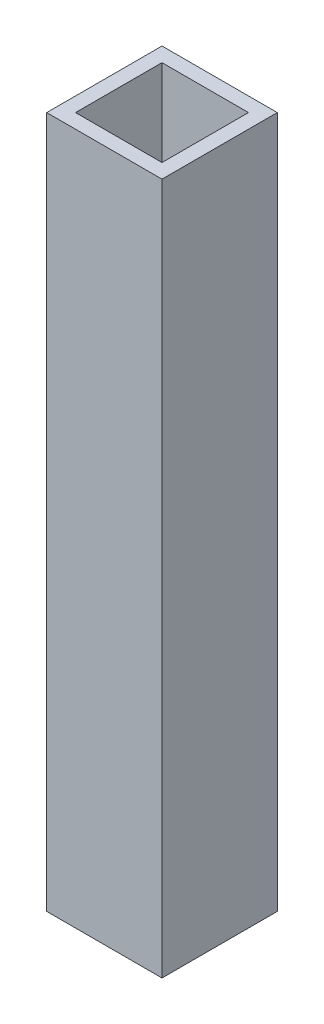
ISO-10303-21;
HEADER;
FILE_DESCRIPTION(('STEP AP214'),'2;1');
FILE_NAME('part.step','',(''),(''),'','','');
FILE_SCHEMA(('AUTOMOTIVE_DESIGN { 1 0 10303 214 1 1 1 1 }'));
ENDSEC;
DATA;
#1=APPLICATION_CONTEXT('core data for automotive mechanical design processes');
#2=APPLICATION_PROTOCOL_DEFINITION('international standard','automotive_design',2000,#1);
#3=PRODUCT_CONTEXT('',#1,'mechanical');
#4=PRODUCT('Part','Part','',(#3));
#5=PRODUCT_RELATED_PRODUCT_CATEGORY('part','',(#4));
#6=PRODUCT_DEFINITION_FORMATION('','',#4);
#7=PRODUCT_DEFINITION_CONTEXT('part definition',#1,'design');
#8=PRODUCT_DEFINITION('design','',#6,#7);
#9=PRODUCT_DEFINITION_SHAPE('','',#8);
#10=(LENGTH_UNIT() NAMED_UNIT(*) SI_UNIT(.MILLI.,.METRE.));
#11=(NAMED_UNIT(*) PLANE_ANGLE_UNIT() SI_UNIT($,.RADIAN.));
#12=(NAMED_UNIT(*) SI_UNIT($,.STERADIAN.) SOLID_ANGLE_UNIT());
#13=UNCERTAINTY_MEASURE_WITH_UNIT(LENGTH_MEASURE(1.E-05),#10,'distance_accuracy_value','');
#14=(GEOMETRIC_REPRESENTATION_CONTEXT(3) GLOBAL_UNCERTAINTY_ASSIGNED_CONTEXT((#13)) GLOBAL_UNIT_ASSIGNED_CONTEXT((#10,
#11,#12)) REPRESENTATION_CONTEXT('',''));
#15=CARTESIAN_POINT('',(0.,0.,0.));
#16=DIRECTION('',(0.,0.,1.));
#17=DIRECTION('',(1.,0.,0.));
#18=AXIS2_PLACEMENT_3D('',#15,#16,#17);
#19=CARTESIAN_POINT('',(0.,152.4,0.));
#20=DIRECTION('',(0.,-1.,0.));
#21=DIRECTION('',(0.,0.,-1.));
#22=AXIS2_PLACEMENT_3D('',#19,#20,#21);
#23=PLANE('',#22);
#24=DIRECTION('',(0.,0.,1.));
#25=VECTOR('',#24,1.);
#26=CARTESIAN_POINT('',(0.,152.4,0.));
#27=LINE('',#26,#25);
#28=CARTESIAN_POINT('',(0.,152.4,-25.4));
#29=VERTEX_POINT('',#28);
#30=CARTESIAN_POINT('',(0.,152.4,0.));
#31=VERTEX_POINT('',#30);
#32=EDGE_CURVE('E134',#29,#31,#27,.T.);
#33=ORIENTED_EDGE('',*,*,#32,.T.);
#34=DIRECTION('',(1.,0.,0.));
#35=VECTOR('',#34,1.);
#36=CARTESIAN_POINT('',(0.,152.4,0.));
#37=LINE('',#36,#35);
#38=CARTESIAN_POINT('',(25.4,152.4,0.));
#39=VERTEX_POINT('',#38);
#40=EDGE_CURVE('E137',#31,#39,#37,.T.);
#41=ORIENTED_EDGE('',*,*,#40,.T.);
#42=DIRECTION('',(0.,0.,-1.));
#43=VECTOR('',#42,1.);
#44=CARTESIAN_POINT('',(25.4,152.4,0.));
#45=LINE('',#44,#43);
#46=CARTESIAN_POINT('',(25.4,152.4,-25.4));
#47=VERTEX_POINT('',#46);
#48=EDGE_CURVE('E140',#39,#47,#45,.T.);
#49=ORIENTED_EDGE('',*,*,#48,.T.);
#50=DIRECTION('',(-1.,0.,0.));
#51=VECTOR('',#50,1.);
#52=CARTESIAN_POINT('',(0.,152.4,-25.4));
#53=LINE('',#52,#51);
#54=EDGE_CURVE('E142',#47,#29,#53,.T.);
#55=ORIENTED_EDGE('',*,*,#54,.T.);
#56=EDGE_LOOP('',(#33,#41,#49,#55));
#57=FACE_BOUND('',#56,.T.);
#58=DIRECTION('',(0.,0.,1.));
#59=VECTOR('',#58,1.);
#60=CARTESIAN_POINT('',(3.175,152.4,-3.175));
#61=LINE('',#60,#59);
#62=CARTESIAN_POINT('',(3.175,152.4,-22.225));
#63=VERTEX_POINT('',#62);
#64=CARTESIAN_POINT('',(3.175,152.4,-3.175));
#65=VERTEX_POINT('',#64);
#66=EDGE_CURVE('E98',#63,#65,#61,.T.);
#67=ORIENTED_EDGE('',*,*,#66,.F.);
#68=DIRECTION('',(-1.,0.,0.));
#69=VECTOR('',#68,1.);
#70=CARTESIAN_POINT('',(3.175,152.4,-22.225));
#71=LINE('',#70,#69);
#72=CARTESIAN_POINT('',(22.225,152.4,-22.225));
#73=VERTEX_POINT('',#72);
#74=EDGE_CURVE('E120',#73,#63,#71,.T.);
#75=ORIENTED_EDGE('',*,*,#74,.F.);
#76=DIRECTION('',(0.,0.,-1.));
#77=VECTOR('',#76,1.);
#78=CARTESIAN_POINT('',(22.225,152.4,-3.175));
#79=LINE('',#78,#77);
#80=CARTESIAN_POINT('',(22.225,152.4,-3.175));
#81=VERTEX_POINT('',#80);
#82=EDGE_CURVE('E118',#81,#73,#79,.T.);
#83=ORIENTED_EDGE('',*,*,#82,.F.);
#84=DIRECTION('',(1.,0.,0.));
#85=VECTOR('',#84,1.);
#86=CARTESIAN_POINT('',(3.175,152.4,-3.175));
#87=LINE('',#86,#85);
#88=EDGE_CURVE('E106',#65,#81,#87,.T.);
#89=ORIENTED_EDGE('',*,*,#88,.F.);
#90=EDGE_LOOP('',(#67,#75,#83,#89));
#91=FACE_BOUND('',#90,.T.);
#92=ADVANCED_FACE('F33',(#57,#91),#23,.F.);
#93=CARTESIAN_POINT('',(0.,0.,0.));
#94=DIRECTION('',(0.,-1.,0.));
#95=DIRECTION('',(0.,0.,-1.));
#96=AXIS2_PLACEMENT_3D('',#93,#94,#95);
#97=PLANE('',#96);
#98=DIRECTION('',(0.,0.,1.));
#99=VECTOR('',#98,1.);
#100=CARTESIAN_POINT('',(0.,0.,0.));
#101=LINE('',#100,#99);
#102=CARTESIAN_POINT('',(0.,0.,-25.4));
#103=VERTEX_POINT('',#102);
#104=CARTESIAN_POINT('',(0.,0.,0.));
#105=VERTEX_POINT('',#104);
#106=EDGE_CURVE('E114',#103,#105,#101,.T.);
#107=ORIENTED_EDGE('',*,*,#106,.F.);
#108=DIRECTION('',(-1.,0.,0.));
#109=VECTOR('',#108,1.);
#110=CARTESIAN_POINT('',(0.,0.,-25.4));
#111=LINE('',#110,#109);
#112=CARTESIAN_POINT('',(25.4,0.,-25.4));
#113=VERTEX_POINT('',#112);
#114=EDGE_CURVE('E138',#113,#103,#111,.T.);
#115=ORIENTED_EDGE('',*,*,#114,.F.);
#116=DIRECTION('',(0.,0.,-1.));
#117=VECTOR('',#116,1.);
#118=CARTESIAN_POINT('',(25.4,0.,0.));
#119=LINE('',#118,#117);
#120=CARTESIAN_POINT('',(25.4,0.,0.));
#121=VERTEX_POINT('',#120);
#122=EDGE_CURVE('E149',#121,#113,#119,.T.);
#123=ORIENTED_EDGE('',*,*,#122,.F.);
#124=DIRECTION('',(1.,0.,0.));
#125=VECTOR('',#124,1.);
#126=CARTESIAN_POINT('',(0.,0.,0.));
#127=LINE('',#126,#125);
#128=EDGE_CURVE('E147',#105,#121,#127,.T.);
#129=ORIENTED_EDGE('',*,*,#128,.F.);
#130=EDGE_LOOP('',(#107,#115,#123,#129));
#131=FACE_BOUND('',#130,.T.);
#132=DIRECTION('',(-1.,0.,0.));
#133=VECTOR('',#132,1.);
#134=CARTESIAN_POINT('',(3.175,0.,-22.225));
#135=LINE('',#134,#133);
#136=CARTESIAN_POINT('',(22.225,0.,-22.225));
#137=VERTEX_POINT('',#136);
#138=CARTESIAN_POINT('',(3.175,0.,-22.225));
#139=VERTEX_POINT('',#138);
#140=EDGE_CURVE('E107',#137,#139,#135,.T.);
#141=ORIENTED_EDGE('',*,*,#140,.T.);
#142=DIRECTION('',(0.,0.,1.));
#143=VECTOR('',#142,1.);
#144=CARTESIAN_POINT('',(3.175,0.,-3.175));
#145=LINE('',#144,#143);
#146=CARTESIAN_POINT('',(3.175,0.,-3.175));
#147=VERTEX_POINT('',#146);
#148=EDGE_CURVE('E56',#139,#147,#145,.T.);
#149=ORIENTED_EDGE('',*,*,#148,.T.);
#150=DIRECTION('',(1.,0.,0.));
#151=VECTOR('',#150,1.);
#152=CARTESIAN_POINT('',(3.175,0.,-3.175));
#153=LINE('',#152,#151);
#154=CARTESIAN_POINT('',(22.225,0.,-3.175));
#155=VERTEX_POINT('',#154);
#156=EDGE_CURVE('E113',#147,#155,#153,.T.);
#157=ORIENTED_EDGE('',*,*,#156,.T.);
#158=DIRECTION('',(0.,0.,-1.));
#159=VECTOR('',#158,1.);
#160=CARTESIAN_POINT('',(22.225,0.,-3.175));
#161=LINE('',#160,#159);
#162=EDGE_CURVE('E126',#155,#137,#161,.T.);
#163=ORIENTED_EDGE('',*,*,#162,.T.);
#164=EDGE_LOOP('',(#141,#149,#157,#163));
#165=FACE_BOUND('',#164,.T.);
#166=ADVANCED_FACE('F167',(#131,#165),#97,.T.);
#167=CARTESIAN_POINT('',(0.,152.4,0.));
#168=DIRECTION('',(1.,0.,0.));
#169=DIRECTION('',(0.,0.,-1.));
#170=AXIS2_PLACEMENT_3D('',#167,#168,#169);
#171=PLANE('',#170);
#172=ORIENTED_EDGE('',*,*,#106,.T.);
#173=DIRECTION('',(0.,-1.,0.));
#174=VECTOR('',#173,1.);
#175=CARTESIAN_POINT('',(0.,152.4,0.));
#176=LINE('',#175,#174);
#177=EDGE_CURVE('E11',#31,#105,#176,.T.);
#178=ORIENTED_EDGE('',*,*,#177,.F.);
#179=ORIENTED_EDGE('',*,*,#32,.F.);
#180=DIRECTION('',(0.,-1.,0.));
#181=VECTOR('',#180,1.);
#182=CARTESIAN_POINT('',(0.,152.4,-25.4));
#183=LINE('',#182,#181);
#184=EDGE_CURVE('E144',#29,#103,#183,.T.);
#185=ORIENTED_EDGE('',*,*,#184,.T.);
#186=EDGE_LOOP('',(#172,#178,#179,#185));
#187=FACE_BOUND('',#186,.T.);
#188=ADVANCED_FACE('F35',(#187),#171,.F.);
#189=CARTESIAN_POINT('',(0.,152.4,0.));
#190=DIRECTION('',(0.,0.,-1.));
#191=DIRECTION('',(-1.,0.,0.));
#192=AXIS2_PLACEMENT_3D('',#189,#190,#191);
#193=PLANE('',#192);
#194=ORIENTED_EDGE('',*,*,#128,.T.);
#195=DIRECTION('',(0.,-1.,0.));
#196=VECTOR('',#195,1.);
#197=CARTESIAN_POINT('',(25.4,152.4,0.));
#198=LINE('',#197,#196);
#199=EDGE_CURVE('E41',#39,#121,#198,.T.);
#200=ORIENTED_EDGE('',*,*,#199,.F.);
#201=ORIENTED_EDGE('',*,*,#40,.F.);
#202=ORIENTED_EDGE('',*,*,#177,.T.);
#203=EDGE_LOOP('',(#194,#200,#201,#202));
#204=FACE_BOUND('',#203,.T.);
#205=ADVANCED_FACE('F177',(#204),#193,.F.);
#206=CARTESIAN_POINT('',(25.4,152.4,0.));
#207=DIRECTION('',(-1.,0.,0.));
#208=DIRECTION('',(0.,0.,1.));
#209=AXIS2_PLACEMENT_3D('',#206,#207,#208);
#210=PLANE('',#209);
#211=ORIENTED_EDGE('',*,*,#122,.T.);
#212=DIRECTION('',(0.,-1.,0.));
#213=VECTOR('',#212,1.);
#214=CARTESIAN_POINT('',(25.4,152.4,-25.4));
#215=LINE('',#214,#213);
#216=EDGE_CURVE('E154',#47,#113,#215,.T.);
#217=ORIENTED_EDGE('',*,*,#216,.F.);
#218=ORIENTED_EDGE('',*,*,#48,.F.);
#219=ORIENTED_EDGE('',*,*,#199,.T.);
#220=EDGE_LOOP('',(#211,#217,#218,#219));
#221=FACE_BOUND('',#220,.T.);
#222=ADVANCED_FACE('F161',(#221),#210,.F.);
#223=CARTESIAN_POINT('',(0.,152.4,-25.4));
#224=DIRECTION('',(0.,0.,1.));
#225=DIRECTION('',(1.,0.,0.));
#226=AXIS2_PLACEMENT_3D('',#223,#224,#225);
#227=PLANE('',#226);
#228=ORIENTED_EDGE('',*,*,#114,.T.);
#229=ORIENTED_EDGE('',*,*,#184,.F.);
#230=ORIENTED_EDGE('',*,*,#54,.F.);
#231=ORIENTED_EDGE('',*,*,#216,.T.);
#232=EDGE_LOOP('',(#228,#229,#230,#231));
#233=FACE_BOUND('',#232,.T.);
#234=ADVANCED_FACE('F171',(#233),#227,.F.);
#235=CARTESIAN_POINT('',(3.175,152.4,-3.175));
#236=DIRECTION('',(1.,0.,0.));
#237=DIRECTION('',(0.,0.,-1.));
#238=AXIS2_PLACEMENT_3D('',#235,#236,#237);
#239=PLANE('',#238);
#240=ORIENTED_EDGE('',*,*,#148,.F.);
#241=DIRECTION('',(0.,-1.,0.));
#242=VECTOR('',#241,1.);
#243=CARTESIAN_POINT('',(3.175,152.4,-22.225));
#244=LINE('',#243,#242);
#245=EDGE_CURVE('E102',#63,#139,#244,.T.);
#246=ORIENTED_EDGE('',*,*,#245,.F.);
#247=ORIENTED_EDGE('',*,*,#66,.T.);
#248=DIRECTION('',(0.,-1.,0.));
#249=VECTOR('',#248,1.);
#250=CARTESIAN_POINT('',(3.175,152.4,-3.175));
#251=LINE('',#250,#249);
#252=EDGE_CURVE('E101',#65,#147,#251,.T.);
#253=ORIENTED_EDGE('',*,*,#252,.T.);
#254=EDGE_LOOP('',(#240,#246,#247,#253));
#255=FACE_BOUND('',#254,.T.);
#256=ADVANCED_FACE('F100',(#255),#239,.T.);
#257=CARTESIAN_POINT('',(3.175,152.4,-3.175));
#258=DIRECTION('',(0.,0.,-1.));
#259=DIRECTION('',(-1.,0.,0.));
#260=AXIS2_PLACEMENT_3D('',#257,#258,#259);
#261=PLANE('',#260);
#262=ORIENTED_EDGE('',*,*,#156,.F.);
#263=ORIENTED_EDGE('',*,*,#252,.F.);
#264=ORIENTED_EDGE('',*,*,#88,.T.);
#265=DIRECTION('',(0.,-1.,0.));
#266=VECTOR('',#265,1.);
#267=CARTESIAN_POINT('',(22.225,152.4,-3.175));
#268=LINE('',#267,#266);
#269=EDGE_CURVE('E115',#81,#155,#268,.T.);
#270=ORIENTED_EDGE('',*,*,#269,.T.);
#271=EDGE_LOOP('',(#262,#263,#264,#270));
#272=FACE_BOUND('',#271,.T.);
#273=ADVANCED_FACE('F110',(#272),#261,.T.);
#274=CARTESIAN_POINT('',(22.225,152.4,-3.175));
#275=DIRECTION('',(-1.,0.,0.));
#276=DIRECTION('',(0.,0.,1.));
#277=AXIS2_PLACEMENT_3D('',#274,#275,#276);
#278=PLANE('',#277);
#279=ORIENTED_EDGE('',*,*,#162,.F.);
#280=ORIENTED_EDGE('',*,*,#269,.F.);
#281=ORIENTED_EDGE('',*,*,#82,.T.);
#282=DIRECTION('',(0.,-1.,0.));
#283=VECTOR('',#282,1.);
#284=CARTESIAN_POINT('',(22.225,152.4,-22.225));
#285=LINE('',#284,#283);
#286=EDGE_CURVE('E48',#73,#137,#285,.T.);
#287=ORIENTED_EDGE('',*,*,#286,.T.);
#288=EDGE_LOOP('',(#279,#280,#281,#287));
#289=FACE_BOUND('',#288,.T.);
#290=ADVANCED_FACE('F200',(#289),#278,.T.);
#291=CARTESIAN_POINT('',(3.175,152.4,-22.225));
#292=DIRECTION('',(0.,0.,1.));
#293=DIRECTION('',(1.,0.,0.));
#294=AXIS2_PLACEMENT_3D('',#291,#292,#293);
#295=PLANE('',#294);
#296=ORIENTED_EDGE('',*,*,#140,.F.);
#297=ORIENTED_EDGE('',*,*,#286,.F.);
#298=ORIENTED_EDGE('',*,*,#74,.T.);
#299=ORIENTED_EDGE('',*,*,#245,.T.);
#300=EDGE_LOOP('',(#296,#297,#298,#299));
#301=FACE_BOUND('',#300,.T.);
#302=ADVANCED_FACE('F204',(#301),#295,.T.);
#303=CLOSED_SHELL('',(#92,#166,#188,#205,#222,#234,#256,#273,#290,#302));
#304=MANIFOLD_SOLID_BREP('B2',#303);
#305=ADVANCED_BREP_SHAPE_REPRESENTATION('',(#18,#304),#14);
#306=SHAPE_DEFINITION_REPRESENTATION(#9,#305);
ENDSEC;
END-ISO-10303-21;
